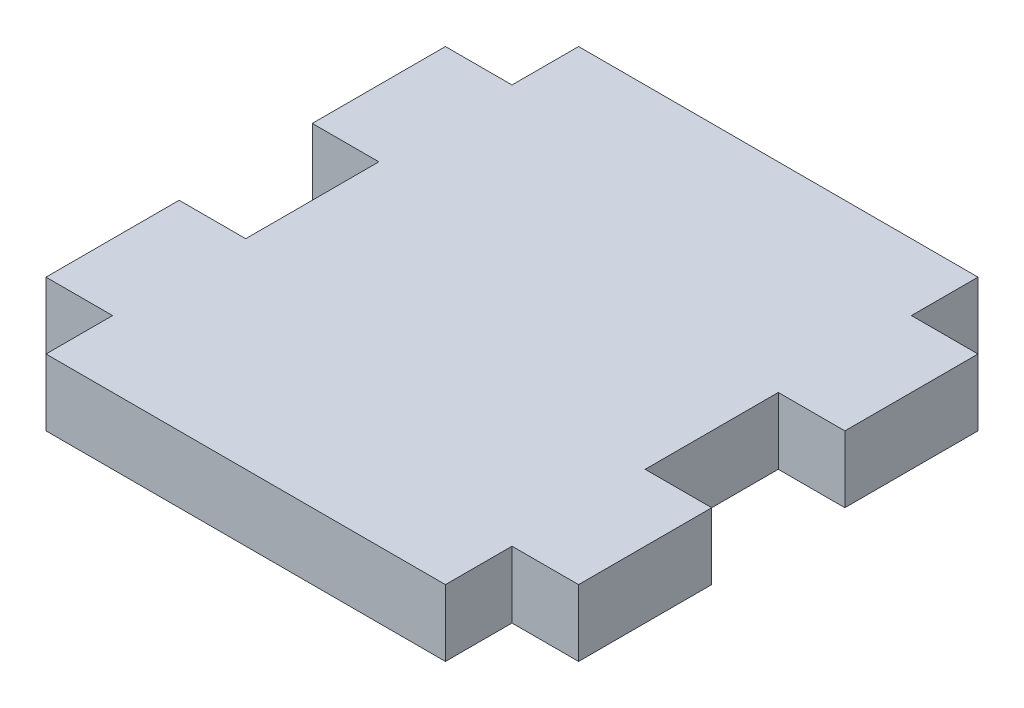
ISO-10303-21;
HEADER;
FILE_DESCRIPTION(('STEP AP214'),'2;1');
FILE_NAME('part.step','',(''),(''),'','','');
FILE_SCHEMA(('AUTOMOTIVE_DESIGN { 1 0 10303 214 1 1 1 1 }'));
ENDSEC;
DATA;
#1=APPLICATION_CONTEXT('core data for automotive mechanical design processes');
#2=APPLICATION_PROTOCOL_DEFINITION('international standard','automotive_design',2000,#1);
#3=PRODUCT_CONTEXT('',#1,'mechanical');
#4=PRODUCT('Part','Part','',(#3));
#5=PRODUCT_RELATED_PRODUCT_CATEGORY('part','',(#4));
#6=PRODUCT_DEFINITION_FORMATION('','',#4);
#7=PRODUCT_DEFINITION_CONTEXT('part definition',#1,'design');
#8=PRODUCT_DEFINITION('design','',#6,#7);
#9=PRODUCT_DEFINITION_SHAPE('','',#8);
#10=(LENGTH_UNIT() NAMED_UNIT(*) SI_UNIT(.MILLI.,.METRE.));
#11=(NAMED_UNIT(*) PLANE_ANGLE_UNIT() SI_UNIT($,.RADIAN.));
#12=(NAMED_UNIT(*) SI_UNIT($,.STERADIAN.) SOLID_ANGLE_UNIT());
#13=UNCERTAINTY_MEASURE_WITH_UNIT(LENGTH_MEASURE(1.E-05),#10,'distance_accuracy_value','');
#14=(GEOMETRIC_REPRESENTATION_CONTEXT(3) GLOBAL_UNCERTAINTY_ASSIGNED_CONTEXT((#13)) GLOBAL_UNIT_ASSIGNED_CONTEXT((#10,
#11,#12)) REPRESENTATION_CONTEXT('',''));
#15=CARTESIAN_POINT('',(0.,0.,0.));
#16=DIRECTION('',(0.,0.,1.));
#17=DIRECTION('',(1.,0.,0.));
#18=AXIS2_PLACEMENT_3D('',#15,#16,#17);
#19=CARTESIAN_POINT('',(0.,5.,0.));
#20=DIRECTION('',(1.,0.,0.));
#21=DIRECTION('',(0.,0.,-1.));
#22=AXIS2_PLACEMENT_3D('',#19,#20,#21);
#23=PLANE('',#22);
#24=DIRECTION('',(0.,0.,1.));
#25=VECTOR('',#24,1.);
#26=CARTESIAN_POINT('',(0.,0.,0.));
#27=LINE('',#26,#25);
#28=CARTESIAN_POINT('',(0.,0.,-5.));
#29=VERTEX_POINT('',#28);
#30=CARTESIAN_POINT('',(0.,0.,0.));
#31=VERTEX_POINT('',#30);
#32=EDGE_CURVE('E203',#29,#31,#27,.T.);
#33=ORIENTED_EDGE('',*,*,#32,.T.);
#34=DIRECTION('',(0.,-1.,0.));
#35=VECTOR('',#34,1.);
#36=CARTESIAN_POINT('',(0.,5.,0.));
#37=LINE('',#36,#35);
#38=CARTESIAN_POINT('',(0.,5.,0.));
#39=VERTEX_POINT('',#38);
#40=EDGE_CURVE('E11',#39,#31,#37,.T.);
#41=ORIENTED_EDGE('',*,*,#40,.F.);
#42=DIRECTION('',(0.,0.,1.));
#43=VECTOR('',#42,1.);
#44=CARTESIAN_POINT('',(0.,5.,0.));
#45=LINE('',#44,#43);
#46=CARTESIAN_POINT('',(0.,5.,-5.));
#47=VERTEX_POINT('',#46);
#48=EDGE_CURVE('E241',#47,#39,#45,.T.);
#49=ORIENTED_EDGE('',*,*,#48,.F.);
#50=DIRECTION('',(0.,-1.,0.));
#51=VECTOR('',#50,1.);
#52=CARTESIAN_POINT('',(0.,5.,-5.));
#53=LINE('',#52,#51);
#54=EDGE_CURVE('E199',#47,#29,#53,.T.);
#55=ORIENTED_EDGE('',*,*,#54,.T.);
#56=EDGE_LOOP('',(#33,#41,#49,#55));
#57=FACE_BOUND('',#56,.T.);
#58=ADVANCED_FACE('F35',(#57),#23,.F.);
#59=CARTESIAN_POINT('',(0.,5.,0.));
#60=DIRECTION('',(0.,0.,-1.));
#61=DIRECTION('',(-1.,0.,0.));
#62=AXIS2_PLACEMENT_3D('',#59,#60,#61);
#63=PLANE('',#62);
#64=DIRECTION('',(1.,0.,0.));
#65=VECTOR('',#64,1.);
#66=CARTESIAN_POINT('',(0.,0.,0.));
#67=LINE('',#66,#65);
#68=CARTESIAN_POINT('',(30.,0.,0.));
#69=VERTEX_POINT('',#68);
#70=EDGE_CURVE('E206',#31,#69,#67,.T.);
#71=ORIENTED_EDGE('',*,*,#70,.T.);
#72=DIRECTION('',(0.,-1.,0.));
#73=VECTOR('',#72,1.);
#74=CARTESIAN_POINT('',(30.,5.,0.));
#75=LINE('',#74,#73);
#76=CARTESIAN_POINT('',(30.,5.,0.));
#77=VERTEX_POINT('',#76);
#78=EDGE_CURVE('E43',#77,#69,#75,.T.);
#79=ORIENTED_EDGE('',*,*,#78,.F.);
#80=DIRECTION('',(1.,0.,0.));
#81=VECTOR('',#80,1.);
#82=CARTESIAN_POINT('',(0.,5.,0.));
#83=LINE('',#82,#81);
#84=EDGE_CURVE('E130',#39,#77,#83,.T.);
#85=ORIENTED_EDGE('',*,*,#84,.F.);
#86=ORIENTED_EDGE('',*,*,#40,.T.);
#87=EDGE_LOOP('',(#71,#79,#85,#86));
#88=FACE_BOUND('',#87,.T.);
#89=ADVANCED_FACE('F359',(#88),#63,.F.);
#90=CARTESIAN_POINT('',(30.,5.,0.));
#91=DIRECTION('',(-1.,0.,0.));
#92=DIRECTION('',(0.,0.,1.));
#93=AXIS2_PLACEMENT_3D('',#90,#91,#92);
#94=PLANE('',#93);
#95=DIRECTION('',(0.,0.,-1.));
#96=VECTOR('',#95,1.);
#97=CARTESIAN_POINT('',(30.,0.,0.));
#98=LINE('',#97,#96);
#99=CARTESIAN_POINT('',(30.,0.,-5.));
#100=VERTEX_POINT('',#99);
#101=EDGE_CURVE('E208',#69,#100,#98,.T.);
#102=ORIENTED_EDGE('',*,*,#101,.T.);
#103=DIRECTION('',(0.,-1.,0.));
#104=VECTOR('',#103,1.);
#105=CARTESIAN_POINT('',(30.,5.,-5.));
#106=LINE('',#105,#104);
#107=CARTESIAN_POINT('',(30.,5.,-5.));
#108=VERTEX_POINT('',#107);
#109=EDGE_CURVE('E284',#108,#100,#106,.T.);
#110=ORIENTED_EDGE('',*,*,#109,.F.);
#111=DIRECTION('',(0.,0.,-1.));
#112=VECTOR('',#111,1.);
#113=CARTESIAN_POINT('',(30.,5.,0.));
#114=LINE('',#113,#112);
#115=EDGE_CURVE('E292',#77,#108,#114,.T.);
#116=ORIENTED_EDGE('',*,*,#115,.F.);
#117=ORIENTED_EDGE('',*,*,#78,.T.);
#118=EDGE_LOOP('',(#102,#110,#116,#117));
#119=FACE_BOUND('',#118,.T.);
#120=ADVANCED_FACE('F290',(#119),#94,.F.);
#121=CARTESIAN_POINT('',(30.,5.,-5.));
#122=DIRECTION('',(0.,0.,-1.));
#123=DIRECTION('',(-1.,0.,0.));
#124=AXIS2_PLACEMENT_3D('',#121,#122,#123);
#125=PLANE('',#124);
#126=DIRECTION('',(1.,0.,0.));
#127=VECTOR('',#126,1.);
#128=CARTESIAN_POINT('',(30.,0.,-5.));
#129=LINE('',#128,#127);
#130=CARTESIAN_POINT('',(35.,0.,-5.));
#131=VERTEX_POINT('',#130);
#132=EDGE_CURVE('E210',#100,#131,#129,.T.);
#133=ORIENTED_EDGE('',*,*,#132,.T.);
#134=DIRECTION('',(0.,-1.,0.));
#135=VECTOR('',#134,1.);
#136=CARTESIAN_POINT('',(35.,5.,-5.));
#137=LINE('',#136,#135);
#138=CARTESIAN_POINT('',(35.,5.,-5.));
#139=VERTEX_POINT('',#138);
#140=EDGE_CURVE('E281',#139,#131,#137,.T.);
#141=ORIENTED_EDGE('',*,*,#140,.F.);
#142=DIRECTION('',(1.,0.,0.));
#143=VECTOR('',#142,1.);
#144=CARTESIAN_POINT('',(30.,5.,-5.));
#145=LINE('',#144,#143);
#146=EDGE_CURVE('E310',#108,#139,#145,.T.);
#147=ORIENTED_EDGE('',*,*,#146,.F.);
#148=ORIENTED_EDGE('',*,*,#109,.T.);
#149=EDGE_LOOP('',(#133,#141,#147,#148));
#150=FACE_BOUND('',#149,.T.);
#151=ADVANCED_FACE('F301',(#150),#125,.F.);
#152=CARTESIAN_POINT('',(35.,5.,-15.));
#153=DIRECTION('',(-1.,0.,0.));
#154=DIRECTION('',(0.,0.,1.));
#155=AXIS2_PLACEMENT_3D('',#152,#153,#154);
#156=PLANE('',#155);
#157=DIRECTION('',(0.,0.,-1.));
#158=VECTOR('',#157,1.);
#159=CARTESIAN_POINT('',(35.,0.,-15.));
#160=LINE('',#159,#158);
#161=CARTESIAN_POINT('',(35.,0.,-15.));
#162=VERTEX_POINT('',#161);
#163=EDGE_CURVE('E212',#131,#162,#160,.T.);
#164=ORIENTED_EDGE('',*,*,#163,.T.);
#165=DIRECTION('',(0.,-1.,0.));
#166=VECTOR('',#165,1.);
#167=CARTESIAN_POINT('',(35.,5.,-15.));
#168=LINE('',#167,#166);
#169=CARTESIAN_POINT('',(35.,5.,-15.));
#170=VERTEX_POINT('',#169);
#171=EDGE_CURVE('E278',#170,#162,#168,.T.);
#172=ORIENTED_EDGE('',*,*,#171,.F.);
#173=DIRECTION('',(0.,0.,-1.));
#174=VECTOR('',#173,1.);
#175=CARTESIAN_POINT('',(35.,5.,-15.));
#176=LINE('',#175,#174);
#177=EDGE_CURVE('E307',#139,#170,#176,.T.);
#178=ORIENTED_EDGE('',*,*,#177,.F.);
#179=ORIENTED_EDGE('',*,*,#140,.T.);
#180=EDGE_LOOP('',(#164,#172,#178,#179));
#181=FACE_BOUND('',#180,.T.);
#182=ADVANCED_FACE('F305',(#181),#156,.F.);
#183=CARTESIAN_POINT('',(30.,5.,-15.));
#184=DIRECTION('',(0.,0.,1.));
#185=DIRECTION('',(1.,0.,0.));
#186=AXIS2_PLACEMENT_3D('',#183,#184,#185);
#187=PLANE('',#186);
#188=DIRECTION('',(-1.,0.,0.));
#189=VECTOR('',#188,1.);
#190=CARTESIAN_POINT('',(30.,0.,-15.));
#191=LINE('',#190,#189);
#192=CARTESIAN_POINT('',(30.,0.,-15.));
#193=VERTEX_POINT('',#192);
#194=EDGE_CURVE('E214',#162,#193,#191,.T.);
#195=ORIENTED_EDGE('',*,*,#194,.T.);
#196=DIRECTION('',(0.,-1.,0.));
#197=VECTOR('',#196,1.);
#198=CARTESIAN_POINT('',(30.,5.,-15.));
#199=LINE('',#198,#197);
#200=CARTESIAN_POINT('',(30.,5.,-15.));
#201=VERTEX_POINT('',#200);
#202=EDGE_CURVE('E275',#201,#193,#199,.T.);
#203=ORIENTED_EDGE('',*,*,#202,.F.);
#204=DIRECTION('',(-1.,0.,0.));
#205=VECTOR('',#204,1.);
#206=CARTESIAN_POINT('',(30.,5.,-15.));
#207=LINE('',#206,#205);
#208=EDGE_CURVE('E309',#170,#201,#207,.T.);
#209=ORIENTED_EDGE('',*,*,#208,.F.);
#210=ORIENTED_EDGE('',*,*,#171,.T.);
#211=EDGE_LOOP('',(#195,#203,#209,#210));
#212=FACE_BOUND('',#211,.T.);
#213=ADVANCED_FACE('F372',(#212),#187,.F.);
#214=CARTESIAN_POINT('',(30.,5.,-15.));
#215=DIRECTION('',(-1.,0.,0.));
#216=DIRECTION('',(0.,0.,1.));
#217=AXIS2_PLACEMENT_3D('',#214,#215,#216);
#218=PLANE('',#217);
#219=DIRECTION('',(0.,0.,-1.));
#220=VECTOR('',#219,1.);
#221=CARTESIAN_POINT('',(30.,0.,-15.));
#222=LINE('',#221,#220);
#223=CARTESIAN_POINT('',(30.,0.,-25.));
#224=VERTEX_POINT('',#223);
#225=EDGE_CURVE('E216',#193,#224,#222,.T.);
#226=ORIENTED_EDGE('',*,*,#225,.T.);
#227=DIRECTION('',(0.,-1.,0.));
#228=VECTOR('',#227,1.);
#229=CARTESIAN_POINT('',(30.,5.,-25.));
#230=LINE('',#229,#228);
#231=CARTESIAN_POINT('',(30.,5.,-25.));
#232=VERTEX_POINT('',#231);
#233=EDGE_CURVE('E272',#232,#224,#230,.T.);
#234=ORIENTED_EDGE('',*,*,#233,.F.);
#235=DIRECTION('',(0.,0.,-1.));
#236=VECTOR('',#235,1.);
#237=CARTESIAN_POINT('',(30.,5.,-15.));
#238=LINE('',#237,#236);
#239=EDGE_CURVE('E312',#201,#232,#238,.T.);
#240=ORIENTED_EDGE('',*,*,#239,.F.);
#241=ORIENTED_EDGE('',*,*,#202,.T.);
#242=EDGE_LOOP('',(#226,#234,#240,#241));
#243=FACE_BOUND('',#242,.T.);
#244=ADVANCED_FACE('F375',(#243),#218,.F.);
#245=CARTESIAN_POINT('',(30.,5.,-25.));
#246=DIRECTION('',(0.,0.,-1.));
#247=DIRECTION('',(-1.,0.,0.));
#248=AXIS2_PLACEMENT_3D('',#245,#246,#247);
#249=PLANE('',#248);
#250=DIRECTION('',(1.,0.,0.));
#251=VECTOR('',#250,1.);
#252=CARTESIAN_POINT('',(30.,0.,-25.));
#253=LINE('',#252,#251);
#254=CARTESIAN_POINT('',(35.,0.,-25.));
#255=VERTEX_POINT('',#254);
#256=EDGE_CURVE('E218',#224,#255,#253,.T.);
#257=ORIENTED_EDGE('',*,*,#256,.T.);
#258=DIRECTION('',(0.,-1.,0.));
#259=VECTOR('',#258,1.);
#260=CARTESIAN_POINT('',(35.,5.,-25.));
#261=LINE('',#260,#259);
#262=CARTESIAN_POINT('',(35.,5.,-25.));
#263=VERTEX_POINT('',#262);
#264=EDGE_CURVE('E269',#263,#255,#261,.T.);
#265=ORIENTED_EDGE('',*,*,#264,.F.);
#266=DIRECTION('',(1.,0.,0.));
#267=VECTOR('',#266,1.);
#268=CARTESIAN_POINT('',(30.,5.,-25.));
#269=LINE('',#268,#267);
#270=EDGE_CURVE('E318',#232,#263,#269,.T.);
#271=ORIENTED_EDGE('',*,*,#270,.F.);
#272=ORIENTED_EDGE('',*,*,#233,.T.);
#273=EDGE_LOOP('',(#257,#265,#271,#272));
#274=FACE_BOUND('',#273,.T.);
#275=ADVANCED_FACE('F379',(#274),#249,.F.);
#276=CARTESIAN_POINT('',(35.,5.,-35.));
#277=DIRECTION('',(-1.,0.,0.));
#278=DIRECTION('',(0.,0.,1.));
#279=AXIS2_PLACEMENT_3D('',#276,#277,#278);
#280=PLANE('',#279);
#281=DIRECTION('',(0.,0.,-1.));
#282=VECTOR('',#281,1.);
#283=CARTESIAN_POINT('',(35.,0.,-35.));
#284=LINE('',#283,#282);
#285=CARTESIAN_POINT('',(35.,0.,-35.));
#286=VERTEX_POINT('',#285);
#287=EDGE_CURVE('E220',#255,#286,#284,.T.);
#288=ORIENTED_EDGE('',*,*,#287,.T.);
#289=DIRECTION('',(0.,-1.,0.));
#290=VECTOR('',#289,1.);
#291=CARTESIAN_POINT('',(35.,5.,-35.));
#292=LINE('',#291,#290);
#293=CARTESIAN_POINT('',(35.,5.,-35.));
#294=VERTEX_POINT('',#293);
#295=EDGE_CURVE('E266',#294,#286,#292,.T.);
#296=ORIENTED_EDGE('',*,*,#295,.F.);
#297=DIRECTION('',(0.,0.,-1.));
#298=VECTOR('',#297,1.);
#299=CARTESIAN_POINT('',(35.,5.,-35.));
#300=LINE('',#299,#298);
#301=EDGE_CURVE('E320',#263,#294,#300,.T.);
#302=ORIENTED_EDGE('',*,*,#301,.F.);
#303=ORIENTED_EDGE('',*,*,#264,.T.);
#304=EDGE_LOOP('',(#288,#296,#302,#303));
#305=FACE_BOUND('',#304,.T.);
#306=ADVANCED_FACE('F383',(#305),#280,.F.);
#307=CARTESIAN_POINT('',(30.,5.,-35.));
#308=DIRECTION('',(0.,0.,1.));
#309=DIRECTION('',(1.,0.,0.));
#310=AXIS2_PLACEMENT_3D('',#307,#308,#309);
#311=PLANE('',#310);
#312=DIRECTION('',(-1.,0.,0.));
#313=VECTOR('',#312,1.);
#314=CARTESIAN_POINT('',(30.,0.,-35.));
#315=LINE('',#314,#313);
#316=CARTESIAN_POINT('',(30.,0.,-35.));
#317=VERTEX_POINT('',#316);
#318=EDGE_CURVE('E222',#286,#317,#315,.T.);
#319=ORIENTED_EDGE('',*,*,#318,.T.);
#320=DIRECTION('',(0.,-1.,0.));
#321=VECTOR('',#320,1.);
#322=CARTESIAN_POINT('',(30.,5.,-35.));
#323=LINE('',#322,#321);
#324=CARTESIAN_POINT('',(30.,5.,-35.));
#325=VERTEX_POINT('',#324);
#326=EDGE_CURVE('E263',#325,#317,#323,.T.);
#327=ORIENTED_EDGE('',*,*,#326,.F.);
#328=DIRECTION('',(-1.,0.,0.));
#329=VECTOR('',#328,1.);
#330=CARTESIAN_POINT('',(30.,5.,-35.));
#331=LINE('',#330,#329);
#332=EDGE_CURVE('E322',#294,#325,#331,.T.);
#333=ORIENTED_EDGE('',*,*,#332,.F.);
#334=ORIENTED_EDGE('',*,*,#295,.T.);
#335=EDGE_LOOP('',(#319,#327,#333,#334));
#336=FACE_BOUND('',#335,.T.);
#337=ADVANCED_FACE('F387',(#336),#311,.F.);
#338=CARTESIAN_POINT('',(30.,5.,-35.));
#339=DIRECTION('',(-1.,0.,0.));
#340=DIRECTION('',(0.,0.,1.));
#341=AXIS2_PLACEMENT_3D('',#338,#339,#340);
#342=PLANE('',#341);
#343=DIRECTION('',(0.,0.,-1.));
#344=VECTOR('',#343,1.);
#345=CARTESIAN_POINT('',(30.,0.,-35.));
#346=LINE('',#345,#344);
#347=CARTESIAN_POINT('',(30.,0.,-40.));
#348=VERTEX_POINT('',#347);
#349=EDGE_CURVE('E224',#317,#348,#346,.T.);
#350=ORIENTED_EDGE('',*,*,#349,.T.);
#351=DIRECTION('',(0.,-1.,0.));
#352=VECTOR('',#351,1.);
#353=CARTESIAN_POINT('',(30.,5.,-40.));
#354=LINE('',#353,#352);
#355=CARTESIAN_POINT('',(30.,5.,-40.));
#356=VERTEX_POINT('',#355);
#357=EDGE_CURVE('E260',#356,#348,#354,.T.);
#358=ORIENTED_EDGE('',*,*,#357,.F.);
#359=DIRECTION('',(0.,0.,-1.));
#360=VECTOR('',#359,1.);
#361=CARTESIAN_POINT('',(30.,5.,-35.));
#362=LINE('',#361,#360);
#363=EDGE_CURVE('E324',#325,#356,#362,.T.);
#364=ORIENTED_EDGE('',*,*,#363,.F.);
#365=ORIENTED_EDGE('',*,*,#326,.T.);
#366=EDGE_LOOP('',(#350,#358,#364,#365));
#367=FACE_BOUND('',#366,.T.);
#368=ADVANCED_FACE('F391',(#367),#342,.F.);
#369=CARTESIAN_POINT('',(0.,5.,-40.));
#370=DIRECTION('',(0.,0.,1.));
#371=DIRECTION('',(1.,0.,0.));
#372=AXIS2_PLACEMENT_3D('',#369,#370,#371);
#373=PLANE('',#372);
#374=DIRECTION('',(-1.,0.,0.));
#375=VECTOR('',#374,1.);
#376=CARTESIAN_POINT('',(0.,0.,-40.));
#377=LINE('',#376,#375);
#378=CARTESIAN_POINT('',(0.,0.,-40.));
#379=VERTEX_POINT('',#378);
#380=EDGE_CURVE('E226',#348,#379,#377,.T.);
#381=ORIENTED_EDGE('',*,*,#380,.T.);
#382=DIRECTION('',(0.,-1.,0.));
#383=VECTOR('',#382,1.);
#384=CARTESIAN_POINT('',(0.,5.,-40.));
#385=LINE('',#384,#383);
#386=CARTESIAN_POINT('',(0.,5.,-40.));
#387=VERTEX_POINT('',#386);
#388=EDGE_CURVE('E257',#387,#379,#385,.T.);
#389=ORIENTED_EDGE('',*,*,#388,.F.);
#390=DIRECTION('',(-1.,0.,0.));
#391=VECTOR('',#390,1.);
#392=CARTESIAN_POINT('',(0.,5.,-40.));
#393=LINE('',#392,#391);
#394=EDGE_CURVE('E326',#356,#387,#393,.T.);
#395=ORIENTED_EDGE('',*,*,#394,.F.);
#396=ORIENTED_EDGE('',*,*,#357,.T.);
#397=EDGE_LOOP('',(#381,#389,#395,#396));
#398=FACE_BOUND('',#397,.T.);
#399=ADVANCED_FACE('F395',(#398),#373,.F.);
#400=CARTESIAN_POINT('',(0.,5.,-35.));
#401=DIRECTION('',(1.,0.,0.));
#402=DIRECTION('',(0.,0.,-1.));
#403=AXIS2_PLACEMENT_3D('',#400,#401,#402);
#404=PLANE('',#403);
#405=DIRECTION('',(0.,0.,1.));
#406=VECTOR('',#405,1.);
#407=CARTESIAN_POINT('',(0.,0.,-35.));
#408=LINE('',#407,#406);
#409=CARTESIAN_POINT('',(0.,0.,-35.));
#410=VERTEX_POINT('',#409);
#411=EDGE_CURVE('E228',#379,#410,#408,.T.);
#412=ORIENTED_EDGE('',*,*,#411,.T.);
#413=DIRECTION('',(0.,-1.,0.));
#414=VECTOR('',#413,1.);
#415=CARTESIAN_POINT('',(0.,5.,-35.));
#416=LINE('',#415,#414);
#417=CARTESIAN_POINT('',(0.,5.,-35.));
#418=VERTEX_POINT('',#417);
#419=EDGE_CURVE('E254',#418,#410,#416,.T.);
#420=ORIENTED_EDGE('',*,*,#419,.F.);
#421=DIRECTION('',(0.,0.,1.));
#422=VECTOR('',#421,1.);
#423=CARTESIAN_POINT('',(0.,5.,-35.));
#424=LINE('',#423,#422);
#425=EDGE_CURVE('E328',#387,#418,#424,.T.);
#426=ORIENTED_EDGE('',*,*,#425,.F.);
#427=ORIENTED_EDGE('',*,*,#388,.T.);
#428=EDGE_LOOP('',(#412,#420,#426,#427));
#429=FACE_BOUND('',#428,.T.);
#430=ADVANCED_FACE('F399',(#429),#404,.F.);
#431=CARTESIAN_POINT('',(-5.,5.,-35.));
#432=DIRECTION('',(0.,0.,1.));
#433=DIRECTION('',(1.,0.,0.));
#434=AXIS2_PLACEMENT_3D('',#431,#432,#433);
#435=PLANE('',#434);
#436=DIRECTION('',(-1.,0.,0.));
#437=VECTOR('',#436,1.);
#438=CARTESIAN_POINT('',(-5.,0.,-35.));
#439=LINE('',#438,#437);
#440=CARTESIAN_POINT('',(-5.,0.,-35.));
#441=VERTEX_POINT('',#440);
#442=EDGE_CURVE('E230',#410,#441,#439,.T.);
#443=ORIENTED_EDGE('',*,*,#442,.T.);
#444=DIRECTION('',(0.,-1.,0.));
#445=VECTOR('',#444,1.);
#446=CARTESIAN_POINT('',(-5.,5.,-35.));
#447=LINE('',#446,#445);
#448=CARTESIAN_POINT('',(-5.,5.,-35.));
#449=VERTEX_POINT('',#448);
#450=EDGE_CURVE('E251',#449,#441,#447,.T.);
#451=ORIENTED_EDGE('',*,*,#450,.F.);
#452=DIRECTION('',(-1.,0.,0.));
#453=VECTOR('',#452,1.);
#454=CARTESIAN_POINT('',(-5.,5.,-35.));
#455=LINE('',#454,#453);
#456=EDGE_CURVE('E330',#418,#449,#455,.T.);
#457=ORIENTED_EDGE('',*,*,#456,.F.);
#458=ORIENTED_EDGE('',*,*,#419,.T.);
#459=EDGE_LOOP('',(#443,#451,#457,#458));
#460=FACE_BOUND('',#459,.T.);
#461=ADVANCED_FACE('F403',(#460),#435,.F.);
#462=CARTESIAN_POINT('',(-5.,5.,-35.));
#463=DIRECTION('',(1.,0.,0.));
#464=DIRECTION('',(0.,0.,-1.));
#465=AXIS2_PLACEMENT_3D('',#462,#463,#464);
#466=PLANE('',#465);
#467=DIRECTION('',(0.,0.,1.));
#468=VECTOR('',#467,1.);
#469=CARTESIAN_POINT('',(-5.,0.,-35.));
#470=LINE('',#469,#468);
#471=CARTESIAN_POINT('',(-5.,0.,-25.));
#472=VERTEX_POINT('',#471);
#473=EDGE_CURVE('E232',#441,#472,#470,.T.);
#474=ORIENTED_EDGE('',*,*,#473,.T.);
#475=DIRECTION('',(0.,-1.,0.));
#476=VECTOR('',#475,1.);
#477=CARTESIAN_POINT('',(-5.,5.,-25.));
#478=LINE('',#477,#476);
#479=CARTESIAN_POINT('',(-5.,5.,-25.));
#480=VERTEX_POINT('',#479);
#481=EDGE_CURVE('E248',#480,#472,#478,.T.);
#482=ORIENTED_EDGE('',*,*,#481,.F.);
#483=DIRECTION('',(0.,0.,1.));
#484=VECTOR('',#483,1.);
#485=CARTESIAN_POINT('',(-5.,5.,-35.));
#486=LINE('',#485,#484);
#487=EDGE_CURVE('E332',#449,#480,#486,.T.);
#488=ORIENTED_EDGE('',*,*,#487,.F.);
#489=ORIENTED_EDGE('',*,*,#450,.T.);
#490=EDGE_LOOP('',(#474,#482,#488,#489));
#491=FACE_BOUND('',#490,.T.);
#492=ADVANCED_FACE('F407',(#491),#466,.F.);
#493=CARTESIAN_POINT('',(-5.,5.,-25.));
#494=DIRECTION('',(0.,0.,-1.));
#495=DIRECTION('',(-1.,0.,0.));
#496=AXIS2_PLACEMENT_3D('',#493,#494,#495);
#497=PLANE('',#496);
#498=DIRECTION('',(1.,0.,0.));
#499=VECTOR('',#498,1.);
#500=CARTESIAN_POINT('',(-5.,0.,-25.));
#501=LINE('',#500,#499);
#502=CARTESIAN_POINT('',(0.,0.,-25.));
#503=VERTEX_POINT('',#502);
#504=EDGE_CURVE('E234',#472,#503,#501,.T.);
#505=ORIENTED_EDGE('',*,*,#504,.T.);
#506=DIRECTION('',(0.,-1.,0.));
#507=VECTOR('',#506,1.);
#508=CARTESIAN_POINT('',(0.,5.,-25.));
#509=LINE('',#508,#507);
#510=CARTESIAN_POINT('',(0.,5.,-25.));
#511=VERTEX_POINT('',#510);
#512=EDGE_CURVE('E245',#511,#503,#509,.T.);
#513=ORIENTED_EDGE('',*,*,#512,.F.);
#514=DIRECTION('',(1.,0.,0.));
#515=VECTOR('',#514,1.);
#516=CARTESIAN_POINT('',(-5.,5.,-25.));
#517=LINE('',#516,#515);
#518=EDGE_CURVE('E334',#480,#511,#517,.T.);
#519=ORIENTED_EDGE('',*,*,#518,.F.);
#520=ORIENTED_EDGE('',*,*,#481,.T.);
#521=EDGE_LOOP('',(#505,#513,#519,#520));
#522=FACE_BOUND('',#521,.T.);
#523=ADVANCED_FACE('F340',(#522),#497,.F.);
#524=CARTESIAN_POINT('',(0.,5.,-15.));
#525=DIRECTION('',(1.,0.,0.));
#526=DIRECTION('',(0.,0.,-1.));
#527=AXIS2_PLACEMENT_3D('',#524,#525,#526);
#528=PLANE('',#527);
#529=DIRECTION('',(0.,0.,1.));
#530=VECTOR('',#529,1.);
#531=CARTESIAN_POINT('',(0.,0.,-15.));
#532=LINE('',#531,#530);
#533=CARTESIAN_POINT('',(0.,0.,-15.));
#534=VERTEX_POINT('',#533);
#535=EDGE_CURVE('E236',#503,#534,#532,.T.);
#536=ORIENTED_EDGE('',*,*,#535,.T.);
#537=DIRECTION('',(0.,-1.,0.));
#538=VECTOR('',#537,1.);
#539=CARTESIAN_POINT('',(0.,5.,-15.));
#540=LINE('',#539,#538);
#541=CARTESIAN_POINT('',(0.,5.,-15.));
#542=VERTEX_POINT('',#541);
#543=EDGE_CURVE('E194',#542,#534,#540,.T.);
#544=ORIENTED_EDGE('',*,*,#543,.F.);
#545=DIRECTION('',(0.,0.,1.));
#546=VECTOR('',#545,1.);
#547=CARTESIAN_POINT('',(0.,5.,-15.));
#548=LINE('',#547,#546);
#549=EDGE_CURVE('E185',#511,#542,#548,.T.);
#550=ORIENTED_EDGE('',*,*,#549,.F.);
#551=ORIENTED_EDGE('',*,*,#512,.T.);
#552=EDGE_LOOP('',(#536,#544,#550,#551));
#553=FACE_BOUND('',#552,.T.);
#554=ADVANCED_FACE('F344',(#553),#528,.F.);
#555=CARTESIAN_POINT('',(-5.,5.,-15.));
#556=DIRECTION('',(0.,0.,1.));
#557=DIRECTION('',(1.,0.,0.));
#558=AXIS2_PLACEMENT_3D('',#555,#556,#557);
#559=PLANE('',#558);
#560=DIRECTION('',(-1.,0.,0.));
#561=VECTOR('',#560,1.);
#562=CARTESIAN_POINT('',(-5.,0.,-15.));
#563=LINE('',#562,#561);
#564=CARTESIAN_POINT('',(-5.,0.,-15.));
#565=VERTEX_POINT('',#564);
#566=EDGE_CURVE('E193',#534,#565,#563,.T.);
#567=ORIENTED_EDGE('',*,*,#566,.T.);
#568=DIRECTION('',(0.,-1.,0.));
#569=VECTOR('',#568,1.);
#570=CARTESIAN_POINT('',(-5.,5.,-15.));
#571=LINE('',#570,#569);
#572=CARTESIAN_POINT('',(-5.,5.,-15.));
#573=VERTEX_POINT('',#572);
#574=EDGE_CURVE('E190',#573,#565,#571,.T.);
#575=ORIENTED_EDGE('',*,*,#574,.F.);
#576=DIRECTION('',(-1.,0.,0.));
#577=VECTOR('',#576,1.);
#578=CARTESIAN_POINT('',(-5.,5.,-15.));
#579=LINE('',#578,#577);
#580=EDGE_CURVE('E179',#542,#573,#579,.T.);
#581=ORIENTED_EDGE('',*,*,#580,.F.);
#582=ORIENTED_EDGE('',*,*,#543,.T.);
#583=EDGE_LOOP('',(#567,#575,#581,#582));
#584=FACE_BOUND('',#583,.T.);
#585=ADVANCED_FACE('F191',(#584),#559,.F.);
#586=CARTESIAN_POINT('',(-5.,5.,-15.));
#587=DIRECTION('',(1.,0.,0.));
#588=DIRECTION('',(0.,0.,-1.));
#589=AXIS2_PLACEMENT_3D('',#586,#587,#588);
#590=PLANE('',#589);
#591=DIRECTION('',(0.,0.,1.));
#592=VECTOR('',#591,1.);
#593=CARTESIAN_POINT('',(-5.,0.,-15.));
#594=LINE('',#593,#592);
#595=CARTESIAN_POINT('',(-4.99999999999999,0.,-5.));
#596=VERTEX_POINT('',#595);
#597=EDGE_CURVE('E116',#565,#596,#594,.T.);
#598=ORIENTED_EDGE('',*,*,#597,.T.);
#599=DIRECTION('',(0.,-1.,0.));
#600=VECTOR('',#599,1.);
#601=CARTESIAN_POINT('',(-4.99999999999999,5.,-5.));
#602=LINE('',#601,#600);
#603=CARTESIAN_POINT('',(-4.99999999999999,5.,-5.));
#604=VERTEX_POINT('',#603);
#605=EDGE_CURVE('E195',#604,#596,#602,.T.);
#606=ORIENTED_EDGE('',*,*,#605,.F.);
#607=DIRECTION('',(0.,0.,1.));
#608=VECTOR('',#607,1.);
#609=CARTESIAN_POINT('',(-5.,5.,-15.));
#610=LINE('',#609,#608);
#611=EDGE_CURVE('E183',#573,#604,#610,.T.);
#612=ORIENTED_EDGE('',*,*,#611,.F.);
#613=ORIENTED_EDGE('',*,*,#574,.T.);
#614=EDGE_LOOP('',(#598,#606,#612,#613));
#615=FACE_BOUND('',#614,.T.);
#616=ADVANCED_FACE('F197',(#615),#590,.F.);
#617=CARTESIAN_POINT('',(-4.99999999999999,5.,-5.));
#618=DIRECTION('',(0.,0.,-1.));
#619=DIRECTION('',(-1.,0.,0.));
#620=AXIS2_PLACEMENT_3D('',#617,#618,#619);
#621=PLANE('',#620);
#622=DIRECTION('',(1.,0.,0.));
#623=VECTOR('',#622,1.);
#624=CARTESIAN_POINT('',(-4.99999999999999,0.,-5.));
#625=LINE('',#624,#623);
#626=EDGE_CURVE('E122',#596,#29,#625,.T.);
#627=ORIENTED_EDGE('',*,*,#626,.T.);
#628=ORIENTED_EDGE('',*,*,#54,.F.);
#629=DIRECTION('',(1.,0.,0.));
#630=VECTOR('',#629,1.);
#631=CARTESIAN_POINT('',(-4.99999999999999,5.,-5.));
#632=LINE('',#631,#630);
#633=EDGE_CURVE('E51',#604,#47,#632,.T.);
#634=ORIENTED_EDGE('',*,*,#633,.F.);
#635=ORIENTED_EDGE('',*,*,#605,.T.);
#636=EDGE_LOOP('',(#627,#628,#634,#635));
#637=FACE_BOUND('',#636,.T.);
#638=ADVANCED_FACE('F348',(#637),#621,.F.);
#639=CARTESIAN_POINT('',(0.,5.,0.));
#640=DIRECTION('',(0.,-1.,0.));
#641=DIRECTION('',(0.,0.,-1.));
#642=AXIS2_PLACEMENT_3D('',#639,#640,#641);
#643=PLANE('',#642);
#644=ORIENTED_EDGE('',*,*,#48,.T.);
#645=ORIENTED_EDGE('',*,*,#84,.T.);
#646=ORIENTED_EDGE('',*,*,#115,.T.);
#647=ORIENTED_EDGE('',*,*,#146,.T.);
#648=ORIENTED_EDGE('',*,*,#177,.T.);
#649=ORIENTED_EDGE('',*,*,#208,.T.);
#650=ORIENTED_EDGE('',*,*,#239,.T.);
#651=ORIENTED_EDGE('',*,*,#270,.T.);
#652=ORIENTED_EDGE('',*,*,#301,.T.);
#653=ORIENTED_EDGE('',*,*,#332,.T.);
#654=ORIENTED_EDGE('',*,*,#363,.T.);
#655=ORIENTED_EDGE('',*,*,#394,.T.);
#656=ORIENTED_EDGE('',*,*,#425,.T.);
#657=ORIENTED_EDGE('',*,*,#456,.T.);
#658=ORIENTED_EDGE('',*,*,#487,.T.);
#659=ORIENTED_EDGE('',*,*,#518,.T.);
#660=ORIENTED_EDGE('',*,*,#549,.T.);
#661=ORIENTED_EDGE('',*,*,#580,.T.);
#662=ORIENTED_EDGE('',*,*,#611,.T.);
#663=ORIENTED_EDGE('',*,*,#633,.T.);
#664=EDGE_LOOP('',(#644,#645,#646,#647,#648,#649,#650,#651,#652,#653,#654,#655,#656,#657,#658,
#659,#660,#661,#662,#663));
#665=FACE_BOUND('',#664,.T.);
#666=ADVANCED_FACE('F181',(#665),#643,.F.);
#667=CARTESIAN_POINT('',(0.,0.,0.));
#668=DIRECTION('',(0.,-1.,0.));
#669=DIRECTION('',(0.,0.,-1.));
#670=AXIS2_PLACEMENT_3D('',#667,#668,#669);
#671=PLANE('',#670);
#672=ORIENTED_EDGE('',*,*,#32,.F.);
#673=ORIENTED_EDGE('',*,*,#626,.F.);
#674=ORIENTED_EDGE('',*,*,#597,.F.);
#675=ORIENTED_EDGE('',*,*,#566,.F.);
#676=ORIENTED_EDGE('',*,*,#535,.F.);
#677=ORIENTED_EDGE('',*,*,#504,.F.);
#678=ORIENTED_EDGE('',*,*,#473,.F.);
#679=ORIENTED_EDGE('',*,*,#442,.F.);
#680=ORIENTED_EDGE('',*,*,#411,.F.);
#681=ORIENTED_EDGE('',*,*,#380,.F.);
#682=ORIENTED_EDGE('',*,*,#349,.F.);
#683=ORIENTED_EDGE('',*,*,#318,.F.);
#684=ORIENTED_EDGE('',*,*,#287,.F.);
#685=ORIENTED_EDGE('',*,*,#256,.F.);
#686=ORIENTED_EDGE('',*,*,#225,.F.);
#687=ORIENTED_EDGE('',*,*,#194,.F.);
#688=ORIENTED_EDGE('',*,*,#163,.F.);
#689=ORIENTED_EDGE('',*,*,#132,.F.);
#690=ORIENTED_EDGE('',*,*,#101,.F.);
#691=ORIENTED_EDGE('',*,*,#70,.F.);
#692=EDGE_LOOP('',(#672,#673,#674,#675,#676,#677,#678,#679,#680,#681,#682,#683,#684,#685,#686,
#687,#688,#689,#690,#691));
#693=FACE_BOUND('',#692,.T.);
#694=ADVANCED_FACE('F296',(#693),#671,.T.);
#695=CLOSED_SHELL('',(#58,#89,#120,#151,#182,#213,#244,#275,#306,#337,#368,#399,#430,#461,#492,
#523,#554,#585,#616,#638,#666,#694));
#696=MANIFOLD_SOLID_BREP('B2',#695);
#697=ADVANCED_BREP_SHAPE_REPRESENTATION('',(#18,#696),#14);
#698=SHAPE_DEFINITION_REPRESENTATION(#9,#697);
ENDSEC;
END-ISO-10303-21;
